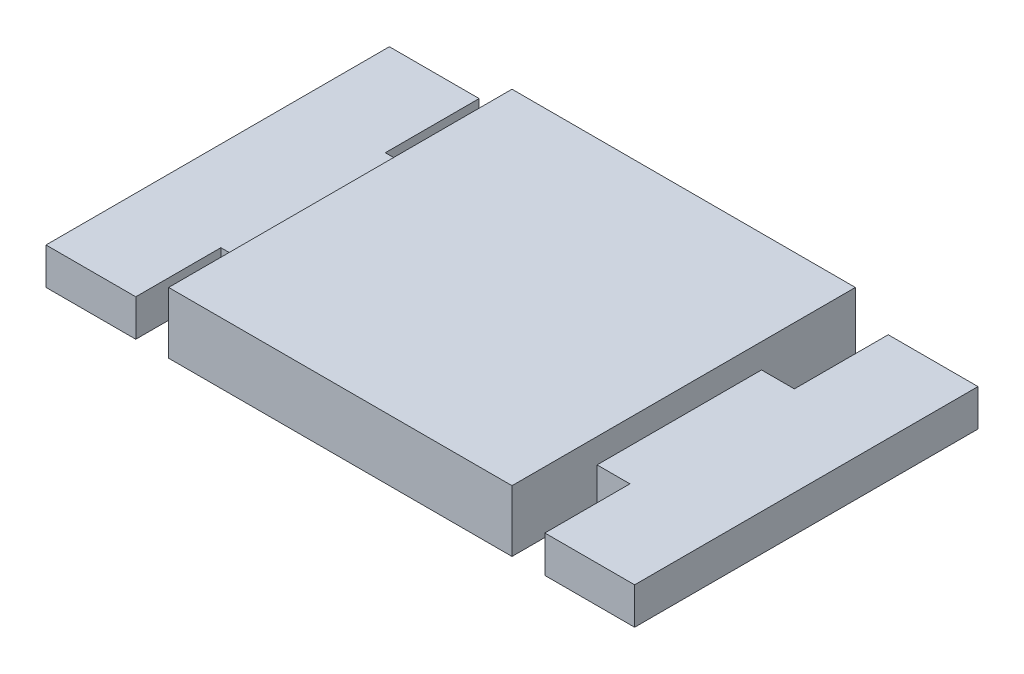
ISO-10303-21;
HEADER;
FILE_DESCRIPTION(('STEP AP214'),'2;1');
FILE_NAME('part.step','',(''),(''),'','','');
FILE_SCHEMA(('AUTOMOTIVE_DESIGN { 1 0 10303 214 1 1 1 1 }'));
ENDSEC;
DATA;
#1=APPLICATION_CONTEXT('core data for automotive mechanical design processes');
#2=APPLICATION_PROTOCOL_DEFINITION('international standard','automotive_design',2000,#1);
#3=PRODUCT_CONTEXT('',#1,'mechanical');
#4=PRODUCT('Part','Part','',(#3));
#5=PRODUCT_RELATED_PRODUCT_CATEGORY('part','',(#4));
#6=PRODUCT_DEFINITION_FORMATION('','',#4);
#7=PRODUCT_DEFINITION_CONTEXT('part definition',#1,'design');
#8=PRODUCT_DEFINITION('design','',#6,#7);
#9=PRODUCT_DEFINITION_SHAPE('','',#8);
#10=(LENGTH_UNIT() NAMED_UNIT(*) SI_UNIT(.MILLI.,.METRE.));
#11=(NAMED_UNIT(*) PLANE_ANGLE_UNIT() SI_UNIT($,.RADIAN.));
#12=(NAMED_UNIT(*) SI_UNIT($,.STERADIAN.) SOLID_ANGLE_UNIT());
#13=UNCERTAINTY_MEASURE_WITH_UNIT(LENGTH_MEASURE(1.E-05),#10,'distance_accuracy_value','');
#14=(GEOMETRIC_REPRESENTATION_CONTEXT(3) GLOBAL_UNCERTAINTY_ASSIGNED_CONTEXT((#13)) GLOBAL_UNIT_ASSIGNED_CONTEXT((#10,
#11,#12)) REPRESENTATION_CONTEXT('',''));
#15=CARTESIAN_POINT('',(0.,0.,0.));
#16=DIRECTION('',(0.,0.,1.));
#17=DIRECTION('',(1.,0.,0.));
#18=AXIS2_PLACEMENT_3D('',#15,#16,#17);
#19=CARTESIAN_POINT('',(0.,3.,0.));
#20=DIRECTION('',(0.,-1.,0.));
#21=DIRECTION('',(0.,0.,-1.));
#22=AXIS2_PLACEMENT_3D('',#19,#20,#21);
#23=PLANE('',#22);
#24=DIRECTION('',(0.,0.,1.));
#25=VECTOR('',#24,1.);
#26=CARTESIAN_POINT('',(0.,3.,-16.9366877971474));
#27=LINE('',#26,#25);
#28=CARTESIAN_POINT('',(0.,3.,-9.28389213789445));
#29=VERTEX_POINT('',#28);
#30=CARTESIAN_POINT('',(0.,3.,4.12513502024729));
#31=VERTEX_POINT('',#30);
#32=EDGE_CURVE('E11',#29,#31,#27,.T.);
#33=ORIENTED_EDGE('',*,*,#32,.F.);
#34=DIRECTION('',(-1.,0.,0.));
#35=VECTOR('',#34,1.);
#36=CARTESIAN_POINT('',(0.,3.,-9.28389213789445));
#37=LINE('',#36,#35);
#38=CARTESIAN_POINT('',(-2.6789794251525,3.,-9.28389213789446));
#39=VERTEX_POINT('',#38);
#40=EDGE_CURVE('E239',#29,#39,#37,.T.);
#41=ORIENTED_EDGE('',*,*,#40,.T.);
#42=DIRECTION('',(0.,0.,-1.));
#43=VECTOR('',#42,1.);
#44=CARTESIAN_POINT('',(-2.6789794251525,3.,-9.28389213789446));
#45=LINE('',#44,#43);
#46=CARTESIAN_POINT('',(-2.6789794251525,3.,-16.9366877971474));
#47=VERTEX_POINT('',#46);
#48=EDGE_CURVE('E301',#39,#47,#45,.T.);
#49=ORIENTED_EDGE('',*,*,#48,.T.);
#50=DIRECTION('',(-1.,0.,0.));
#51=VECTOR('',#50,1.);
#52=CARTESIAN_POINT('',(-2.6789794251525,3.,-16.9366877971474));
#53=LINE('',#52,#51);
#54=CARTESIAN_POINT('',(-10.,3.,-16.9366877971474));
#55=VERTEX_POINT('',#54);
#56=EDGE_CURVE('E331',#47,#55,#53,.T.);
#57=ORIENTED_EDGE('',*,*,#56,.T.);
#58=DIRECTION('',(0.,0.,1.));
#59=VECTOR('',#58,1.);
#60=CARTESIAN_POINT('',(-10.,3.,-16.9366877971474));
#61=LINE('',#60,#59);
#62=CARTESIAN_POINT('',(-10.,3.,11.0633122028526));
#63=VERTEX_POINT('',#62);
#64=EDGE_CURVE('E329',#55,#63,#61,.T.);
#65=ORIENTED_EDGE('',*,*,#64,.T.);
#66=DIRECTION('',(1.,0.,0.));
#67=VECTOR('',#66,1.);
#68=CARTESIAN_POINT('',(-10.,3.,11.0633122028526));
#69=LINE('',#68,#67);
#70=CARTESIAN_POINT('',(-2.6789794251525,3.,11.0633122028526));
#71=VERTEX_POINT('',#70);
#72=EDGE_CURVE('E327',#63,#71,#69,.T.);
#73=ORIENTED_EDGE('',*,*,#72,.T.);
#74=DIRECTION('',(0.,0.,-1.));
#75=VECTOR('',#74,1.);
#76=CARTESIAN_POINT('',(-2.6789794251525,3.,11.0633122028526));
#77=LINE('',#76,#75);
#78=CARTESIAN_POINT('',(-2.6789794251525,3.,4.12513502024729));
#79=VERTEX_POINT('',#78);
#80=EDGE_CURVE('E293',#71,#79,#77,.T.);
#81=ORIENTED_EDGE('',*,*,#80,.T.);
#82=DIRECTION('',(1.,0.,0.));
#83=VECTOR('',#82,1.);
#84=CARTESIAN_POINT('',(-2.6789794251525,3.,4.12513502024729));
#85=LINE('',#84,#83);
#86=EDGE_CURVE('E290',#79,#31,#85,.T.);
#87=ORIENTED_EDGE('',*,*,#86,.T.);
#88=EDGE_LOOP('',(#33,#41,#49,#57,#65,#73,#81,#87));
#89=FACE_BOUND('',#88,.T.);
#90=ADVANCED_FACE('F34',(#89),#23,.F.);
#91=DIRECTION('',(0.,0.,-1.));
#92=VECTOR('',#91,1.);
#93=CARTESIAN_POINT('',(28.,3.,-16.9366877971474));
#94=LINE('',#93,#92);
#95=CARTESIAN_POINT('',(28.,3.,4.12513502024728));
#96=VERTEX_POINT('',#95);
#97=CARTESIAN_POINT('',(28.,3.,-9.28389213789446));
#98=VERTEX_POINT('',#97);
#99=EDGE_CURVE('E44',#96,#98,#94,.T.);
#100=ORIENTED_EDGE('',*,*,#99,.F.);
#101=DIRECTION('',(1.,0.,0.));
#102=VECTOR('',#101,1.);
#103=CARTESIAN_POINT('',(30.6789794251525,3.,4.12513502024728));
#104=LINE('',#103,#102);
#105=CARTESIAN_POINT('',(30.6789794251525,3.,4.12513502024728));
#106=VERTEX_POINT('',#105);
#107=EDGE_CURVE('E292',#96,#106,#104,.T.);
#108=ORIENTED_EDGE('',*,*,#107,.T.);
#109=DIRECTION('',(0.,0.,1.));
#110=VECTOR('',#109,1.);
#111=CARTESIAN_POINT('',(30.6789794251525,3.,11.0633122028526));
#112=LINE('',#111,#110);
#113=CARTESIAN_POINT('',(30.6789794251525,3.,11.0633122028526));
#114=VERTEX_POINT('',#113);
#115=EDGE_CURVE('E317',#106,#114,#112,.T.);
#116=ORIENTED_EDGE('',*,*,#115,.T.);
#117=DIRECTION('',(1.,0.,0.));
#118=VECTOR('',#117,1.);
#119=CARTESIAN_POINT('',(38.,3.,11.0633122028526));
#120=LINE('',#119,#118);
#121=CARTESIAN_POINT('',(38.,3.,11.0633122028526));
#122=VERTEX_POINT('',#121);
#123=EDGE_CURVE('E320',#114,#122,#120,.T.);
#124=ORIENTED_EDGE('',*,*,#123,.T.);
#125=DIRECTION('',(0.,0.,-1.));
#126=VECTOR('',#125,1.);
#127=CARTESIAN_POINT('',(38.,3.,-16.9366877971474));
#128=LINE('',#127,#126);
#129=CARTESIAN_POINT('',(38.,3.,-16.9366877971474));
#130=VERTEX_POINT('',#129);
#131=EDGE_CURVE('E178',#122,#130,#128,.T.);
#132=ORIENTED_EDGE('',*,*,#131,.T.);
#133=DIRECTION('',(-1.,0.,0.));
#134=VECTOR('',#133,1.);
#135=CARTESIAN_POINT('',(30.6789794251525,3.,-16.9366877971474));
#136=LINE('',#135,#134);
#137=CARTESIAN_POINT('',(30.6789794251525,3.,-16.9366877971474));
#138=VERTEX_POINT('',#137);
#139=EDGE_CURVE('E171',#130,#138,#136,.T.);
#140=ORIENTED_EDGE('',*,*,#139,.T.);
#141=DIRECTION('',(0.,0.,1.));
#142=VECTOR('',#141,1.);
#143=CARTESIAN_POINT('',(30.6789794251525,3.,-9.28389213789446));
#144=LINE('',#143,#142);
#145=CARTESIAN_POINT('',(30.6789794251525,3.,-9.28389213789446));
#146=VERTEX_POINT('',#145);
#147=EDGE_CURVE('E175',#138,#146,#144,.T.);
#148=ORIENTED_EDGE('',*,*,#147,.T.);
#149=DIRECTION('',(-1.,0.,0.));
#150=VECTOR('',#149,1.);
#151=CARTESIAN_POINT('',(28.,3.,-9.28389213789446));
#152=LINE('',#151,#150);
#153=EDGE_CURVE('E53',#146,#98,#152,.T.);
#154=ORIENTED_EDGE('',*,*,#153,.T.);
#155=EDGE_LOOP('',(#100,#108,#116,#124,#132,#140,#148,#154));
#156=FACE_BOUND('',#155,.T.);
#157=ADVANCED_FACE('F173',(#156),#23,.F.);
#158=CARTESIAN_POINT('',(0.,3.,-9.28389213789445));
#159=DIRECTION('',(0.,0.,1.));
#160=DIRECTION('',(1.,0.,0.));
#161=AXIS2_PLACEMENT_3D('',#158,#159,#160);
#162=PLANE('',#161);
#163=DIRECTION('',(-1.,0.,0.));
#164=VECTOR('',#163,1.);
#165=CARTESIAN_POINT('',(0.,0.,-9.28389213789445));
#166=LINE('',#165,#164);
#167=CARTESIAN_POINT('',(0.,0.,-9.28389213789445));
#168=VERTEX_POINT('',#167);
#169=CARTESIAN_POINT('',(-2.6789794251525,0.,-9.28389213789446));
#170=VERTEX_POINT('',#169);
#171=EDGE_CURVE('E203',#168,#170,#166,.T.);
#172=ORIENTED_EDGE('',*,*,#171,.T.);
#173=DIRECTION('',(0.,-1.,0.));
#174=VECTOR('',#173,1.);
#175=CARTESIAN_POINT('',(-2.6789794251525,3.,-9.28389213789446));
#176=LINE('',#175,#174);
#177=EDGE_CURVE('E278',#39,#170,#176,.T.);
#178=ORIENTED_EDGE('',*,*,#177,.F.);
#179=ORIENTED_EDGE('',*,*,#40,.F.);
#180=DIRECTION('',(0.,-1.,0.));
#181=VECTOR('',#180,1.);
#182=CARTESIAN_POINT('',(0.,3.,-9.28389213789445));
#183=LINE('',#182,#181);
#184=EDGE_CURVE('E281',#29,#168,#183,.T.);
#185=ORIENTED_EDGE('',*,*,#184,.T.);
#186=EDGE_LOOP('',(#172,#178,#179,#185));
#187=FACE_BOUND('',#186,.T.);
#188=ADVANCED_FACE('F36',(#187),#162,.F.);
#189=CARTESIAN_POINT('',(-2.6789794251525,3.,-9.28389213789446));
#190=DIRECTION('',(-1.,0.,0.));
#191=DIRECTION('',(0.,0.,1.));
#192=AXIS2_PLACEMENT_3D('',#189,#190,#191);
#193=PLANE('',#192);
#194=DIRECTION('',(0.,0.,-1.));
#195=VECTOR('',#194,1.);
#196=CARTESIAN_POINT('',(-2.6789794251525,0.,-9.28389213789446));
#197=LINE('',#196,#195);
#198=CARTESIAN_POINT('',(-2.6789794251525,0.,-16.9366877971474));
#199=VERTEX_POINT('',#198);
#200=EDGE_CURVE('E206',#170,#199,#197,.T.);
#201=ORIENTED_EDGE('',*,*,#200,.T.);
#202=DIRECTION('',(0.,-1.,0.));
#203=VECTOR('',#202,1.);
#204=CARTESIAN_POINT('',(-2.6789794251525,3.,-16.9366877971474));
#205=LINE('',#204,#203);
#206=EDGE_CURVE('E275',#47,#199,#205,.T.);
#207=ORIENTED_EDGE('',*,*,#206,.F.);
#208=ORIENTED_EDGE('',*,*,#48,.F.);
#209=ORIENTED_EDGE('',*,*,#177,.T.);
#210=EDGE_LOOP('',(#201,#207,#208,#209));
#211=FACE_BOUND('',#210,.T.);
#212=ADVANCED_FACE('F414',(#211),#193,.F.);
#213=CARTESIAN_POINT('',(-2.6789794251525,3.,-16.9366877971474));
#214=DIRECTION('',(0.,0.,1.));
#215=DIRECTION('',(1.,0.,0.));
#216=AXIS2_PLACEMENT_3D('',#213,#214,#215);
#217=PLANE('',#216);
#218=DIRECTION('',(-1.,0.,0.));
#219=VECTOR('',#218,1.);
#220=CARTESIAN_POINT('',(-2.6789794251525,0.,-16.9366877971474));
#221=LINE('',#220,#219);
#222=CARTESIAN_POINT('',(-10.,0.,-16.9366877971474));
#223=VERTEX_POINT('',#222);
#224=EDGE_CURVE('E208',#199,#223,#221,.T.);
#225=ORIENTED_EDGE('',*,*,#224,.T.);
#226=DIRECTION('',(0.,-1.,0.));
#227=VECTOR('',#226,1.);
#228=CARTESIAN_POINT('',(-10.,3.,-16.9366877971474));
#229=LINE('',#228,#227);
#230=EDGE_CURVE('E272',#55,#223,#229,.T.);
#231=ORIENTED_EDGE('',*,*,#230,.F.);
#232=ORIENTED_EDGE('',*,*,#56,.F.);
#233=ORIENTED_EDGE('',*,*,#206,.T.);
#234=EDGE_LOOP('',(#225,#231,#232,#233));
#235=FACE_BOUND('',#234,.T.);
#236=ADVANCED_FACE('F410',(#235),#217,.F.);
#237=CARTESIAN_POINT('',(-10.,3.,-16.9366877971474));
#238=DIRECTION('',(1.,0.,0.));
#239=DIRECTION('',(0.,0.,-1.));
#240=AXIS2_PLACEMENT_3D('',#237,#238,#239);
#241=PLANE('',#240);
#242=DIRECTION('',(0.,0.,1.));
#243=VECTOR('',#242,1.);
#244=CARTESIAN_POINT('',(-10.,0.,-16.9366877971474));
#245=LINE('',#244,#243);
#246=CARTESIAN_POINT('',(-10.,0.,11.0633122028526));
#247=VERTEX_POINT('',#246);
#248=EDGE_CURVE('E210',#223,#247,#245,.T.);
#249=ORIENTED_EDGE('',*,*,#248,.T.);
#250=DIRECTION('',(0.,-1.,0.));
#251=VECTOR('',#250,1.);
#252=CARTESIAN_POINT('',(-10.,3.,11.0633122028526));
#253=LINE('',#252,#251);
#254=EDGE_CURVE('E269',#63,#247,#253,.T.);
#255=ORIENTED_EDGE('',*,*,#254,.F.);
#256=ORIENTED_EDGE('',*,*,#64,.F.);
#257=ORIENTED_EDGE('',*,*,#230,.T.);
#258=EDGE_LOOP('',(#249,#255,#256,#257));
#259=FACE_BOUND('',#258,.T.);
#260=ADVANCED_FACE('F405',(#259),#241,.F.);
#261=CARTESIAN_POINT('',(-10.,3.,11.0633122028526));
#262=DIRECTION('',(0.,0.,-1.));
#263=DIRECTION('',(-1.,0.,0.));
#264=AXIS2_PLACEMENT_3D('',#261,#262,#263);
#265=PLANE('',#264);
#266=DIRECTION('',(1.,0.,0.));
#267=VECTOR('',#266,1.);
#268=CARTESIAN_POINT('',(-10.,0.,11.0633122028526));
#269=LINE('',#268,#267);
#270=CARTESIAN_POINT('',(-2.6789794251525,0.,11.0633122028526));
#271=VERTEX_POINT('',#270);
#272=EDGE_CURVE('E212',#247,#271,#269,.T.);
#273=ORIENTED_EDGE('',*,*,#272,.T.);
#274=DIRECTION('',(0.,-1.,0.));
#275=VECTOR('',#274,1.);
#276=CARTESIAN_POINT('',(-2.6789794251525,3.,11.0633122028526));
#277=LINE('',#276,#275);
#278=EDGE_CURVE('E266',#71,#271,#277,.T.);
#279=ORIENTED_EDGE('',*,*,#278,.F.);
#280=ORIENTED_EDGE('',*,*,#72,.F.);
#281=ORIENTED_EDGE('',*,*,#254,.T.);
#282=EDGE_LOOP('',(#273,#279,#280,#281));
#283=FACE_BOUND('',#282,.T.);
#284=ADVANCED_FACE('F400',(#283),#265,.F.);
#285=CARTESIAN_POINT('',(-2.6789794251525,3.,11.0633122028526));
#286=DIRECTION('',(-1.,0.,0.));
#287=DIRECTION('',(0.,0.,1.));
#288=AXIS2_PLACEMENT_3D('',#285,#286,#287);
#289=PLANE('',#288);
#290=DIRECTION('',(0.,0.,-1.));
#291=VECTOR('',#290,1.);
#292=CARTESIAN_POINT('',(-2.6789794251525,0.,11.0633122028526));
#293=LINE('',#292,#291);
#294=CARTESIAN_POINT('',(-2.6789794251525,0.,4.12513502024729));
#295=VERTEX_POINT('',#294);
#296=EDGE_CURVE('E214',#271,#295,#293,.T.);
#297=ORIENTED_EDGE('',*,*,#296,.T.);
#298=DIRECTION('',(0.,-1.,0.));
#299=VECTOR('',#298,1.);
#300=CARTESIAN_POINT('',(-2.6789794251525,3.,4.12513502024729));
#301=LINE('',#300,#299);
#302=EDGE_CURVE('E263',#79,#295,#301,.T.);
#303=ORIENTED_EDGE('',*,*,#302,.F.);
#304=ORIENTED_EDGE('',*,*,#80,.F.);
#305=ORIENTED_EDGE('',*,*,#278,.T.);
#306=EDGE_LOOP('',(#297,#303,#304,#305));
#307=FACE_BOUND('',#306,.T.);
#308=ADVANCED_FACE('F396',(#307),#289,.F.);
#309=CARTESIAN_POINT('',(-2.6789794251525,3.,4.12513502024729));
#310=DIRECTION('',(0.,0.,-1.));
#311=DIRECTION('',(-1.,0.,0.));
#312=AXIS2_PLACEMENT_3D('',#309,#310,#311);
#313=PLANE('',#312);
#314=DIRECTION('',(1.,0.,0.));
#315=VECTOR('',#314,1.);
#316=CARTESIAN_POINT('',(-2.6789794251525,0.,4.12513502024729));
#317=LINE('',#316,#315);
#318=CARTESIAN_POINT('',(0.,0.,4.12513502024729));
#319=VERTEX_POINT('',#318);
#320=EDGE_CURVE('E216',#295,#319,#317,.T.);
#321=ORIENTED_EDGE('',*,*,#320,.T.);
#322=DIRECTION('',(0.,-1.,0.));
#323=VECTOR('',#322,1.);
#324=CARTESIAN_POINT('',(0.,3.,4.12513502024729));
#325=LINE('',#324,#323);
#326=EDGE_CURVE('E262',#31,#319,#325,.T.);
#327=ORIENTED_EDGE('',*,*,#326,.F.);
#328=ORIENTED_EDGE('',*,*,#86,.F.);
#329=ORIENTED_EDGE('',*,*,#302,.T.);
#330=EDGE_LOOP('',(#321,#327,#328,#329));
#331=FACE_BOUND('',#330,.T.);
#332=ADVANCED_FACE('F392',(#331),#313,.F.);
#333=CARTESIAN_POINT('',(0.,3.,4.12513502024729));
#334=DIRECTION('',(1.,0.,0.));
#335=DIRECTION('',(0.,0.,-1.));
#336=AXIS2_PLACEMENT_3D('',#333,#334,#335);
#337=PLANE('',#336);
#338=DIRECTION('',(0.,0.,1.));
#339=VECTOR('',#338,1.);
#340=CARTESIAN_POINT('',(0.,0.,4.12513502024729));
#341=LINE('',#340,#339);
#342=CARTESIAN_POINT('',(0.,0.,11.0633122028526));
#343=VERTEX_POINT('',#342);
#344=EDGE_CURVE('E218',#319,#343,#341,.T.);
#345=ORIENTED_EDGE('',*,*,#344,.T.);
#346=DIRECTION('',(0.,-1.,0.));
#347=VECTOR('',#346,1.);
#348=CARTESIAN_POINT('',(0.,3.,11.0633122028526));
#349=LINE('',#348,#347);
#350=CARTESIAN_POINT('',(0.,5.,11.0633122028526));
#351=VERTEX_POINT('',#350);
#352=EDGE_CURVE('E259',#351,#343,#349,.T.);
#353=ORIENTED_EDGE('',*,*,#352,.F.);
#354=DIRECTION('',(0.,0.,1.));
#355=VECTOR('',#354,1.);
#356=CARTESIAN_POINT('',(0.,5.,-16.9366877971474));
#357=LINE('',#356,#355);
#358=CARTESIAN_POINT('',(0.,5.,-16.9366877971474));
#359=VERTEX_POINT('',#358);
#360=EDGE_CURVE('E342',#359,#351,#357,.T.);
#361=ORIENTED_EDGE('',*,*,#360,.F.);
#362=DIRECTION('',(0.,-1.,0.));
#363=VECTOR('',#362,1.);
#364=CARTESIAN_POINT('',(0.,3.,-16.9366877971474));
#365=LINE('',#364,#363);
#366=CARTESIAN_POINT('',(0.,0.,-16.9366877971474));
#367=VERTEX_POINT('',#366);
#368=EDGE_CURVE('E196',#359,#367,#365,.T.);
#369=ORIENTED_EDGE('',*,*,#368,.T.);
#370=DIRECTION('',(0.,0.,1.));
#371=VECTOR('',#370,1.);
#372=CARTESIAN_POINT('',(0.,0.,-16.9366877971474));
#373=LINE('',#372,#371);
#374=EDGE_CURVE('E200',#367,#168,#373,.T.);
#375=ORIENTED_EDGE('',*,*,#374,.T.);
#376=ORIENTED_EDGE('',*,*,#184,.F.);
#377=ORIENTED_EDGE('',*,*,#32,.T.);
#378=ORIENTED_EDGE('',*,*,#326,.T.);
#379=EDGE_LOOP('',(#345,#353,#361,#369,#375,#376,#377,#378));
#380=FACE_BOUND('',#379,.T.);
#381=ADVANCED_FACE('F355',(#380),#337,.F.);
#382=CARTESIAN_POINT('',(0.,3.,11.0633122028526));
#383=DIRECTION('',(0.,0.,-1.));
#384=DIRECTION('',(-1.,0.,0.));
#385=AXIS2_PLACEMENT_3D('',#382,#383,#384);
#386=PLANE('',#385);
#387=DIRECTION('',(1.,0.,0.));
#388=VECTOR('',#387,1.);
#389=CARTESIAN_POINT('',(0.,0.,11.0633122028526));
#390=LINE('',#389,#388);
#391=CARTESIAN_POINT('',(28.,0.,11.0633122028526));
#392=VERTEX_POINT('',#391);
#393=EDGE_CURVE('E220',#343,#392,#390,.T.);
#394=ORIENTED_EDGE('',*,*,#393,.T.);
#395=DIRECTION('',(0.,-1.,0.));
#396=VECTOR('',#395,1.);
#397=CARTESIAN_POINT('',(28.,3.,11.0633122028526));
#398=LINE('',#397,#396);
#399=CARTESIAN_POINT('',(28.,5.,11.0633122028526));
#400=VERTEX_POINT('',#399);
#401=EDGE_CURVE('E256',#400,#392,#398,.T.);
#402=ORIENTED_EDGE('',*,*,#401,.F.);
#403=DIRECTION('',(1.,0.,0.));
#404=VECTOR('',#403,1.);
#405=CARTESIAN_POINT('',(0.,5.,11.0633122028526));
#406=LINE('',#405,#404);
#407=EDGE_CURVE('E339',#351,#400,#406,.T.);
#408=ORIENTED_EDGE('',*,*,#407,.F.);
#409=ORIENTED_EDGE('',*,*,#352,.T.);
#410=EDGE_LOOP('',(#394,#402,#408,#409));
#411=FACE_BOUND('',#410,.T.);
#412=ADVANCED_FACE('F361',(#411),#386,.F.);
#413=CARTESIAN_POINT('',(30.6789794251525,3.,4.12513502024728));
#414=DIRECTION('',(0.,0.,-1.));
#415=DIRECTION('',(-1.,0.,0.));
#416=AXIS2_PLACEMENT_3D('',#413,#414,#415);
#417=PLANE('',#416);
#418=DIRECTION('',(1.,0.,0.));
#419=VECTOR('',#418,1.);
#420=CARTESIAN_POINT('',(30.6789794251525,0.,4.12513502024728));
#421=LINE('',#420,#419);
#422=CARTESIAN_POINT('',(28.,0.,4.12513502024728));
#423=VERTEX_POINT('',#422);
#424=CARTESIAN_POINT('',(30.6789794251525,0.,4.12513502024728));
#425=VERTEX_POINT('',#424);
#426=EDGE_CURVE('E224',#423,#425,#421,.T.);
#427=ORIENTED_EDGE('',*,*,#426,.T.);
#428=DIRECTION('',(0.,-1.,0.));
#429=VECTOR('',#428,1.);
#430=CARTESIAN_POINT('',(30.6789794251525,3.,4.12513502024728));
#431=LINE('',#430,#429);
#432=EDGE_CURVE('E252',#106,#425,#431,.T.);
#433=ORIENTED_EDGE('',*,*,#432,.F.);
#434=ORIENTED_EDGE('',*,*,#107,.F.);
#435=DIRECTION('',(0.,-1.,0.));
#436=VECTOR('',#435,1.);
#437=CARTESIAN_POINT('',(28.,3.,4.12513502024728));
#438=LINE('',#437,#436);
#439=EDGE_CURVE('E255',#96,#423,#438,.T.);
#440=ORIENTED_EDGE('',*,*,#439,.T.);
#441=EDGE_LOOP('',(#427,#433,#434,#440));
#442=FACE_BOUND('',#441,.T.);
#443=ADVANCED_FACE('F372',(#442),#417,.F.);
#444=CARTESIAN_POINT('',(30.6789794251525,3.,11.0633122028526));
#445=DIRECTION('',(1.,0.,0.));
#446=DIRECTION('',(0.,0.,-1.));
#447=AXIS2_PLACEMENT_3D('',#444,#445,#446);
#448=PLANE('',#447);
#449=DIRECTION('',(0.,0.,1.));
#450=VECTOR('',#449,1.);
#451=CARTESIAN_POINT('',(30.6789794251525,0.,11.0633122028526));
#452=LINE('',#451,#450);
#453=CARTESIAN_POINT('',(30.6789794251525,0.,11.0633122028526));
#454=VERTEX_POINT('',#453);
#455=EDGE_CURVE('E226',#425,#454,#452,.T.);
#456=ORIENTED_EDGE('',*,*,#455,.T.);
#457=DIRECTION('',(0.,-1.,0.));
#458=VECTOR('',#457,1.);
#459=CARTESIAN_POINT('',(30.6789794251525,3.,11.0633122028526));
#460=LINE('',#459,#458);
#461=EDGE_CURVE('E249',#114,#454,#460,.T.);
#462=ORIENTED_EDGE('',*,*,#461,.F.);
#463=ORIENTED_EDGE('',*,*,#115,.F.);
#464=ORIENTED_EDGE('',*,*,#432,.T.);
#465=EDGE_LOOP('',(#456,#462,#463,#464));
#466=FACE_BOUND('',#465,.T.);
#467=ADVANCED_FACE('F374',(#466),#448,.F.);
#468=CARTESIAN_POINT('',(38.,3.,11.0633122028526));
#469=DIRECTION('',(0.,0.,-1.));
#470=DIRECTION('',(-1.,0.,0.));
#471=AXIS2_PLACEMENT_3D('',#468,#469,#470);
#472=PLANE('',#471);
#473=DIRECTION('',(1.,0.,0.));
#474=VECTOR('',#473,1.);
#475=CARTESIAN_POINT('',(38.,0.,11.0633122028526));
#476=LINE('',#475,#474);
#477=CARTESIAN_POINT('',(38.,0.,11.0633122028526));
#478=VERTEX_POINT('',#477);
#479=EDGE_CURVE('E228',#454,#478,#476,.T.);
#480=ORIENTED_EDGE('',*,*,#479,.T.);
#481=DIRECTION('',(0.,-1.,0.));
#482=VECTOR('',#481,1.);
#483=CARTESIAN_POINT('',(38.,3.,11.0633122028526));
#484=LINE('',#483,#482);
#485=EDGE_CURVE('E246',#122,#478,#484,.T.);
#486=ORIENTED_EDGE('',*,*,#485,.F.);
#487=ORIENTED_EDGE('',*,*,#123,.F.);
#488=ORIENTED_EDGE('',*,*,#461,.T.);
#489=EDGE_LOOP('',(#480,#486,#487,#488));
#490=FACE_BOUND('',#489,.T.);
#491=ADVANCED_FACE('F378',(#490),#472,.F.);
#492=CARTESIAN_POINT('',(38.,3.,-16.9366877971474));
#493=DIRECTION('',(-1.,0.,0.));
#494=DIRECTION('',(0.,0.,1.));
#495=AXIS2_PLACEMENT_3D('',#492,#493,#494);
#496=PLANE('',#495);
#497=DIRECTION('',(0.,0.,-1.));
#498=VECTOR('',#497,1.);
#499=CARTESIAN_POINT('',(38.,0.,-16.9366877971474));
#500=LINE('',#499,#498);
#501=CARTESIAN_POINT('',(38.,0.,-16.9366877971474));
#502=VERTEX_POINT('',#501);
#503=EDGE_CURVE('E230',#478,#502,#500,.T.);
#504=ORIENTED_EDGE('',*,*,#503,.T.);
#505=DIRECTION('',(0.,-1.,0.));
#506=VECTOR('',#505,1.);
#507=CARTESIAN_POINT('',(38.,3.,-16.9366877971474));
#508=LINE('',#507,#506);
#509=EDGE_CURVE('E190',#130,#502,#508,.T.);
#510=ORIENTED_EDGE('',*,*,#509,.F.);
#511=ORIENTED_EDGE('',*,*,#131,.F.);
#512=ORIENTED_EDGE('',*,*,#485,.T.);
#513=EDGE_LOOP('',(#504,#510,#511,#512));
#514=FACE_BOUND('',#513,.T.);
#515=ADVANCED_FACE('F381',(#514),#496,.F.);
#516=CARTESIAN_POINT('',(30.6789794251525,3.,-16.9366877971474));
#517=DIRECTION('',(0.,0.,1.));
#518=DIRECTION('',(1.,0.,0.));
#519=AXIS2_PLACEMENT_3D('',#516,#517,#518);
#520=PLANE('',#519);
#521=DIRECTION('',(-1.,0.,0.));
#522=VECTOR('',#521,1.);
#523=CARTESIAN_POINT('',(30.6789794251525,0.,-16.9366877971474));
#524=LINE('',#523,#522);
#525=CARTESIAN_POINT('',(30.6789794251525,0.,-16.9366877971474));
#526=VERTEX_POINT('',#525);
#527=EDGE_CURVE('E187',#502,#526,#524,.T.);
#528=ORIENTED_EDGE('',*,*,#527,.T.);
#529=DIRECTION('',(0.,-1.,0.));
#530=VECTOR('',#529,1.);
#531=CARTESIAN_POINT('',(30.6789794251525,3.,-16.9366877971474));
#532=LINE('',#531,#530);
#533=EDGE_CURVE('E184',#138,#526,#532,.T.);
#534=ORIENTED_EDGE('',*,*,#533,.F.);
#535=ORIENTED_EDGE('',*,*,#139,.F.);
#536=ORIENTED_EDGE('',*,*,#509,.T.);
#537=EDGE_LOOP('',(#528,#534,#535,#536));
#538=FACE_BOUND('',#537,.T.);
#539=ADVANCED_FACE('F185',(#538),#520,.F.);
#540=CARTESIAN_POINT('',(30.6789794251525,3.,-9.28389213789446));
#541=DIRECTION('',(1.,0.,0.));
#542=DIRECTION('',(0.,0.,-1.));
#543=AXIS2_PLACEMENT_3D('',#540,#541,#542);
#544=PLANE('',#543);
#545=DIRECTION('',(0.,0.,1.));
#546=VECTOR('',#545,1.);
#547=CARTESIAN_POINT('',(30.6789794251525,0.,-9.28389213789446));
#548=LINE('',#547,#546);
#549=CARTESIAN_POINT('',(30.6789794251525,0.,-9.28389213789446));
#550=VERTEX_POINT('',#549);
#551=EDGE_CURVE('E233',#526,#550,#548,.T.);
#552=ORIENTED_EDGE('',*,*,#551,.T.);
#553=DIRECTION('',(0.,-1.,0.));
#554=VECTOR('',#553,1.);
#555=CARTESIAN_POINT('',(30.6789794251525,3.,-9.28389213789446));
#556=LINE('',#555,#554);
#557=EDGE_CURVE('E191',#146,#550,#556,.T.);
#558=ORIENTED_EDGE('',*,*,#557,.F.);
#559=ORIENTED_EDGE('',*,*,#147,.F.);
#560=ORIENTED_EDGE('',*,*,#533,.T.);
#561=EDGE_LOOP('',(#552,#558,#559,#560));
#562=FACE_BOUND('',#561,.T.);
#563=ADVANCED_FACE('F193',(#562),#544,.F.);
#564=CARTESIAN_POINT('',(28.,3.,-9.28389213789446));
#565=DIRECTION('',(0.,0.,1.));
#566=DIRECTION('',(1.,0.,0.));
#567=AXIS2_PLACEMENT_3D('',#564,#565,#566);
#568=PLANE('',#567);
#569=DIRECTION('',(-1.,0.,0.));
#570=VECTOR('',#569,1.);
#571=CARTESIAN_POINT('',(28.,0.,-9.28389213789446));
#572=LINE('',#571,#570);
#573=CARTESIAN_POINT('',(28.,0.,-9.28389213789446));
#574=VERTEX_POINT('',#573);
#575=EDGE_CURVE('E235',#550,#574,#572,.T.);
#576=ORIENTED_EDGE('',*,*,#575,.T.);
#577=DIRECTION('',(0.,-1.,0.));
#578=VECTOR('',#577,1.);
#579=CARTESIAN_POINT('',(28.,3.,-9.28389213789446));
#580=LINE('',#579,#578);
#581=EDGE_CURVE('E243',#98,#574,#580,.T.);
#582=ORIENTED_EDGE('',*,*,#581,.F.);
#583=ORIENTED_EDGE('',*,*,#153,.F.);
#584=ORIENTED_EDGE('',*,*,#557,.T.);
#585=EDGE_LOOP('',(#576,#582,#583,#584));
#586=FACE_BOUND('',#585,.T.);
#587=ADVANCED_FACE('F384',(#586),#568,.F.);
#588=CARTESIAN_POINT('',(28.,3.,-16.9366877971474));
#589=DIRECTION('',(-1.,0.,0.));
#590=DIRECTION('',(0.,0.,1.));
#591=AXIS2_PLACEMENT_3D('',#588,#589,#590);
#592=PLANE('',#591);
#593=DIRECTION('',(0.,0.,-1.));
#594=VECTOR('',#593,1.);
#595=CARTESIAN_POINT('',(28.,0.,-16.9366877971474));
#596=LINE('',#595,#594);
#597=CARTESIAN_POINT('',(28.,0.,-16.9366877971474));
#598=VERTEX_POINT('',#597);
#599=EDGE_CURVE('E119',#574,#598,#596,.T.);
#600=ORIENTED_EDGE('',*,*,#599,.T.);
#601=DIRECTION('',(0.,-1.,0.));
#602=VECTOR('',#601,1.);
#603=CARTESIAN_POINT('',(28.,3.,-16.9366877971474));
#604=LINE('',#603,#602);
#605=CARTESIAN_POINT('',(28.,5.,-16.9366877971474));
#606=VERTEX_POINT('',#605);
#607=EDGE_CURVE('E241',#606,#598,#604,.T.);
#608=ORIENTED_EDGE('',*,*,#607,.F.);
#609=DIRECTION('',(0.,0.,-1.));
#610=VECTOR('',#609,1.);
#611=CARTESIAN_POINT('',(28.,5.,-16.9366877971474));
#612=LINE('',#611,#610);
#613=EDGE_CURVE('E336',#400,#606,#612,.T.);
#614=ORIENTED_EDGE('',*,*,#613,.F.);
#615=ORIENTED_EDGE('',*,*,#401,.T.);
#616=DIRECTION('',(0.,0.,-1.));
#617=VECTOR('',#616,1.);
#618=CARTESIAN_POINT('',(28.,0.,4.12513502024728));
#619=LINE('',#618,#617);
#620=EDGE_CURVE('E222',#392,#423,#619,.T.);
#621=ORIENTED_EDGE('',*,*,#620,.T.);
#622=ORIENTED_EDGE('',*,*,#439,.F.);
#623=ORIENTED_EDGE('',*,*,#99,.T.);
#624=ORIENTED_EDGE('',*,*,#581,.T.);
#625=EDGE_LOOP('',(#600,#608,#614,#615,#621,#622,#623,#624));
#626=FACE_BOUND('',#625,.T.);
#627=ADVANCED_FACE('F364',(#626),#592,.F.);
#628=CARTESIAN_POINT('',(0.,3.,-16.9366877971474));
#629=DIRECTION('',(0.,0.,1.));
#630=DIRECTION('',(1.,0.,0.));
#631=AXIS2_PLACEMENT_3D('',#628,#629,#630);
#632=PLANE('',#631);
#633=DIRECTION('',(-1.,0.,0.));
#634=VECTOR('',#633,1.);
#635=CARTESIAN_POINT('',(0.,0.,-16.9366877971474));
#636=LINE('',#635,#634);
#637=EDGE_CURVE('E126',#598,#367,#636,.T.);
#638=ORIENTED_EDGE('',*,*,#637,.T.);
#639=ORIENTED_EDGE('',*,*,#368,.F.);
#640=DIRECTION('',(-1.,0.,0.));
#641=VECTOR('',#640,1.);
#642=CARTESIAN_POINT('',(0.,5.,-16.9366877971474));
#643=LINE('',#642,#641);
#644=EDGE_CURVE('E204',#606,#359,#643,.T.);
#645=ORIENTED_EDGE('',*,*,#644,.F.);
#646=ORIENTED_EDGE('',*,*,#607,.T.);
#647=EDGE_LOOP('',(#638,#639,#645,#646));
#648=FACE_BOUND('',#647,.T.);
#649=ADVANCED_FACE('F425',(#648),#632,.F.);
#650=CARTESIAN_POINT('',(0.,0.,0.));
#651=DIRECTION('',(0.,-1.,0.));
#652=DIRECTION('',(0.,0.,-1.));
#653=AXIS2_PLACEMENT_3D('',#650,#651,#652);
#654=PLANE('',#653);
#655=ORIENTED_EDGE('',*,*,#374,.F.);
#656=ORIENTED_EDGE('',*,*,#637,.F.);
#657=ORIENTED_EDGE('',*,*,#599,.F.);
#658=ORIENTED_EDGE('',*,*,#575,.F.);
#659=ORIENTED_EDGE('',*,*,#551,.F.);
#660=ORIENTED_EDGE('',*,*,#527,.F.);
#661=ORIENTED_EDGE('',*,*,#503,.F.);
#662=ORIENTED_EDGE('',*,*,#479,.F.);
#663=ORIENTED_EDGE('',*,*,#455,.F.);
#664=ORIENTED_EDGE('',*,*,#426,.F.);
#665=ORIENTED_EDGE('',*,*,#620,.F.);
#666=ORIENTED_EDGE('',*,*,#393,.F.);
#667=ORIENTED_EDGE('',*,*,#344,.F.);
#668=ORIENTED_EDGE('',*,*,#320,.F.);
#669=ORIENTED_EDGE('',*,*,#296,.F.);
#670=ORIENTED_EDGE('',*,*,#272,.F.);
#671=ORIENTED_EDGE('',*,*,#248,.F.);
#672=ORIENTED_EDGE('',*,*,#224,.F.);
#673=ORIENTED_EDGE('',*,*,#200,.F.);
#674=ORIENTED_EDGE('',*,*,#171,.F.);
#675=EDGE_LOOP('',(#655,#656,#657,#658,#659,#660,#661,#662,#663,#664,#665,#666,#667,#668,#669,
#670,#671,#672,#673,#674));
#676=FACE_BOUND('',#675,.T.);
#677=ADVANCED_FACE('F367',(#676),#654,.T.);
#678=CARTESIAN_POINT('',(0.,5.,0.));
#679=DIRECTION('',(0.,1.,0.));
#680=DIRECTION('',(0.,0.,1.));
#681=AXIS2_PLACEMENT_3D('',#678,#679,#680);
#682=PLANE('',#681);
#683=ORIENTED_EDGE('',*,*,#360,.T.);
#684=ORIENTED_EDGE('',*,*,#407,.T.);
#685=ORIENTED_EDGE('',*,*,#613,.T.);
#686=ORIENTED_EDGE('',*,*,#644,.T.);
#687=EDGE_LOOP('',(#683,#684,#685,#686));
#688=FACE_BOUND('',#687,.T.);
#689=ADVANCED_FACE('F347',(#688),#682,.T.);
#690=CLOSED_SHELL('',(#90,#157,#188,#212,#236,#260,#284,#308,#332,#381,#412,#443,#467,#491,#515,
#539,#563,#587,#627,#649,#677,#689));
#691=MANIFOLD_SOLID_BREP('B2',#690);
#692=ADVANCED_BREP_SHAPE_REPRESENTATION('',(#18,#691),#14);
#693=SHAPE_DEFINITION_REPRESENTATION(#9,#692);
ENDSEC;
END-ISO-10303-21;
